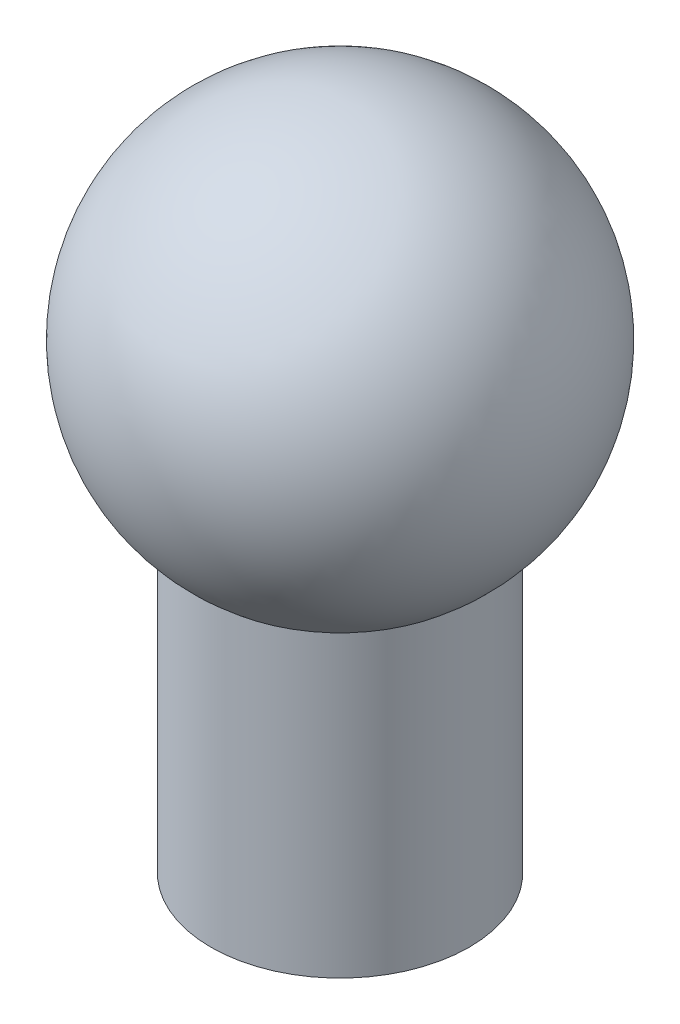
ISO-10303-21;
HEADER;
FILE_DESCRIPTION(('STEP AP214'),'2;1');
FILE_NAME('part.step','',(''),(''),'','','');
FILE_SCHEMA(('AUTOMOTIVE_DESIGN { 1 0 10303 214 1 1 1 1 }'));
ENDSEC;
DATA;
#1=APPLICATION_CONTEXT('core data for automotive mechanical design processes');
#2=APPLICATION_PROTOCOL_DEFINITION('international standard','automotive_design',2000,#1);
#3=PRODUCT_CONTEXT('',#1,'mechanical');
#4=PRODUCT('Part','Part','',(#3));
#5=PRODUCT_RELATED_PRODUCT_CATEGORY('part','',(#4));
#6=PRODUCT_DEFINITION_FORMATION('','',#4);
#7=PRODUCT_DEFINITION_CONTEXT('part definition',#1,'design');
#8=PRODUCT_DEFINITION('design','',#6,#7);
#9=PRODUCT_DEFINITION_SHAPE('','',#8);
#10=(LENGTH_UNIT() NAMED_UNIT(*) SI_UNIT(.MILLI.,.METRE.));
#11=(NAMED_UNIT(*) PLANE_ANGLE_UNIT() SI_UNIT($,.RADIAN.));
#12=(NAMED_UNIT(*) SI_UNIT($,.STERADIAN.) SOLID_ANGLE_UNIT());
#13=UNCERTAINTY_MEASURE_WITH_UNIT(LENGTH_MEASURE(1.E-05),#10,'distance_accuracy_value','');
#14=(GEOMETRIC_REPRESENTATION_CONTEXT(3) GLOBAL_UNCERTAINTY_ASSIGNED_CONTEXT((#13)) GLOBAL_UNIT_ASSIGNED_CONTEXT((#10,
#11,#12)) REPRESENTATION_CONTEXT('',''));
#15=CARTESIAN_POINT('',(0.,0.,0.));
#16=DIRECTION('',(0.,0.,1.));
#17=DIRECTION('',(1.,0.,0.));
#18=AXIS2_PLACEMENT_3D('',#15,#16,#17);
#19=CARTESIAN_POINT('',(0.,10.,0.));
#20=DIRECTION('',(0.,-1.,0.));
#21=DIRECTION('',(0.,0.,-1.));
#22=AXIS2_PLACEMENT_3D('',#19,#20,#21);
#23=CYLINDRICAL_SURFACE('',#22,2.8);
#24=CARTESIAN_POINT('',(0.,0.,0.));
#25=DIRECTION('',(0.,1.,0.));
#26=DIRECTION('',(0.,0.,1.));
#27=AXIS2_PLACEMENT_3D('',#24,#25,#26);
#28=CIRCLE('',#27,2.8);
#29=CARTESIAN_POINT('',(0.,0.,2.8));
#30=VERTEX_POINT('',#29);
#31=EDGE_CURVE('E38',#30,#30,#28,.T.);
#32=ORIENTED_EDGE('',*,*,#31,.T.);
#33=EDGE_LOOP('',(#32));
#34=FACE_BOUND('',#33,.T.);
#35=CARTESIAN_POINT('',(0.,6.47721700923829,0.));
#36=DIRECTION('',(0.,1.,0.));
#37=DIRECTION('',(0.,0.,1.));
#38=AXIS2_PLACEMENT_3D('',#35,#36,#37);
#39=CIRCLE('',#38,2.8);
#40=CARTESIAN_POINT('',(0.,6.47721700923829,2.8));
#41=VERTEX_POINT('',#40);
#42=EDGE_CURVE('E10',#41,#41,#39,.T.);
#43=ORIENTED_EDGE('',*,*,#42,.F.);
#44=EDGE_LOOP('',(#43));
#45=FACE_BOUND('',#44,.T.);
#46=ADVANCED_FACE('F32',(#34,#45),#23,.T.);
#47=CARTESIAN_POINT('',(0.,0.,0.));
#48=DIRECTION('',(0.,1.,0.));
#49=DIRECTION('',(0.,0.,1.));
#50=AXIS2_PLACEMENT_3D('',#47,#48,#49);
#51=PLANE('',#50);
#52=ORIENTED_EDGE('',*,*,#31,.F.);
#53=EDGE_LOOP('',(#52));
#54=FACE_BOUND('',#53,.T.);
#55=ADVANCED_FACE('F46',(#54),#51,.F.);
#56=CARTESIAN_POINT('',(0.,10.,0.));
#57=DIRECTION('',(0.,0.,-1.));
#58=DIRECTION('',(1.,0.,0.));
#59=AXIS2_PLACEMENT_3D('',#56,#57,#58);
#60=SPHERICAL_SURFACE('',#59,4.5);
#61=CARTESIAN_POINT('',(0.,10.,0.));
#62=DIRECTION('',(0.,1.,0.));
#63=DIRECTION('',(0.,0.,1.));
#64=AXIS2_PLACEMENT_3D('',#61,#62,#63);
#65=SPHERICAL_SURFACE('',#64,4.5);
#66=ORIENTED_EDGE('',*,*,#42,.T.);
#67=EDGE_LOOP('',(#66));
#68=FACE_BOUND('',#67,.T.);
#69=ADVANCED_FACE('F48',(#68),#65,.T.);
#70=CLOSED_SHELL('',(#46,#55,#69));
#71=MANIFOLD_SOLID_BREP('B2',#70);
#72=ADVANCED_BREP_SHAPE_REPRESENTATION('',(#18,#71),#14);
#73=SHAPE_DEFINITION_REPRESENTATION(#9,#72);
ENDSEC;
END-ISO-10303-21;
